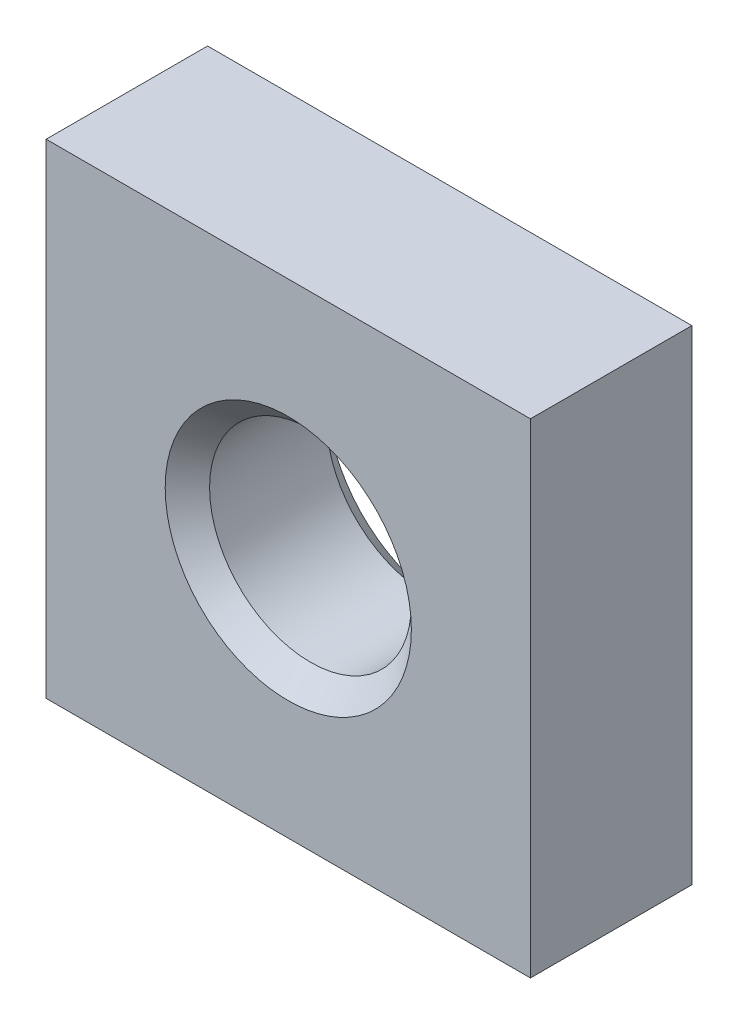
ISO-10303-21;
HEADER;
FILE_DESCRIPTION(('STEP AP214'),'2;1');
FILE_NAME('part.step','',(''),(''),'','','');
FILE_SCHEMA(('AUTOMOTIVE_DESIGN { 1 0 10303 214 1 1 1 1 }'));
ENDSEC;
DATA;
#1=APPLICATION_CONTEXT('core data for automotive mechanical design processes');
#2=APPLICATION_PROTOCOL_DEFINITION('international standard','automotive_design',2000,#1);
#3=PRODUCT_CONTEXT('',#1,'mechanical');
#4=PRODUCT('Part','Part','',(#3));
#5=PRODUCT_RELATED_PRODUCT_CATEGORY('part','',(#4));
#6=PRODUCT_DEFINITION_FORMATION('','',#4);
#7=PRODUCT_DEFINITION_CONTEXT('part definition',#1,'design');
#8=PRODUCT_DEFINITION('design','',#6,#7);
#9=PRODUCT_DEFINITION_SHAPE('','',#8);
#10=(LENGTH_UNIT() NAMED_UNIT(*) SI_UNIT(.MILLI.,.METRE.));
#11=(NAMED_UNIT(*) PLANE_ANGLE_UNIT() SI_UNIT($,.RADIAN.));
#12=(NAMED_UNIT(*) SI_UNIT($,.STERADIAN.) SOLID_ANGLE_UNIT());
#13=UNCERTAINTY_MEASURE_WITH_UNIT(LENGTH_MEASURE(1.E-05),#10,'distance_accuracy_value','');
#14=(GEOMETRIC_REPRESENTATION_CONTEXT(3) GLOBAL_UNCERTAINTY_ASSIGNED_CONTEXT((#13)) GLOBAL_UNIT_ASSIGNED_CONTEXT((#10,
#11,#12)) REPRESENTATION_CONTEXT('',''));
#15=CARTESIAN_POINT('',(0.,0.,0.));
#16=DIRECTION('',(0.,0.,1.));
#17=DIRECTION('',(1.,0.,0.));
#18=AXIS2_PLACEMENT_3D('',#15,#16,#17);
#19=CARTESIAN_POINT('',(3.,-2.99999999999999,2.));
#20=DIRECTION('',(-1.,0.,0.));
#21=DIRECTION('',(0.,0.,1.));
#22=AXIS2_PLACEMENT_3D('',#19,#20,#21);
#23=PLANE('',#22);
#24=DIRECTION('',(0.,1.,0.));
#25=VECTOR('',#24,1.);
#26=CARTESIAN_POINT('',(3.,-2.99999999999999,0.));
#27=LINE('',#26,#25);
#28=CARTESIAN_POINT('',(3.,-2.99999999999999,0.));
#29=VERTEX_POINT('',#28);
#30=CARTESIAN_POINT('',(3.,2.99999999999999,0.));
#31=VERTEX_POINT('',#30);
#32=EDGE_CURVE('E98',#29,#31,#27,.T.);
#33=ORIENTED_EDGE('',*,*,#32,.T.);
#34=DIRECTION('',(0.,0.,-1.));
#35=VECTOR('',#34,1.);
#36=CARTESIAN_POINT('',(3.,2.99999999999999,2.));
#37=LINE('',#36,#35);
#38=CARTESIAN_POINT('',(3.,2.99999999999999,2.));
#39=VERTEX_POINT('',#38);
#40=EDGE_CURVE('E11',#39,#31,#37,.T.);
#41=ORIENTED_EDGE('',*,*,#40,.F.);
#42=DIRECTION('',(0.,1.,0.));
#43=VECTOR('',#42,1.);
#44=CARTESIAN_POINT('',(3.,-2.99999999999999,2.));
#45=LINE('',#44,#43);
#46=CARTESIAN_POINT('',(3.,-2.99999999999999,2.));
#47=VERTEX_POINT('',#46);
#48=EDGE_CURVE('E86',#47,#39,#45,.T.);
#49=ORIENTED_EDGE('',*,*,#48,.F.);
#50=DIRECTION('',(0.,0.,-1.));
#51=VECTOR('',#50,1.);
#52=CARTESIAN_POINT('',(3.,-2.99999999999999,2.));
#53=LINE('',#52,#51);
#54=EDGE_CURVE('E94',#47,#29,#53,.T.);
#55=ORIENTED_EDGE('',*,*,#54,.T.);
#56=EDGE_LOOP('',(#33,#41,#49,#55));
#57=FACE_BOUND('',#56,.T.);
#58=ADVANCED_FACE('F35',(#57),#23,.F.);
#59=CARTESIAN_POINT('',(-3.,2.99999999999999,2.));
#60=DIRECTION('',(0.,-1.,0.));
#61=DIRECTION('',(0.,0.,-1.));
#62=AXIS2_PLACEMENT_3D('',#59,#60,#61);
#63=PLANE('',#62);
#64=DIRECTION('',(-1.,0.,0.));
#65=VECTOR('',#64,1.);
#66=CARTESIAN_POINT('',(-3.,2.99999999999999,0.));
#67=LINE('',#66,#65);
#68=CARTESIAN_POINT('',(-3.,2.99999999999999,0.));
#69=VERTEX_POINT('',#68);
#70=EDGE_CURVE('E90',#31,#69,#67,.T.);
#71=ORIENTED_EDGE('',*,*,#70,.T.);
#72=DIRECTION('',(0.,0.,-1.));
#73=VECTOR('',#72,1.);
#74=CARTESIAN_POINT('',(-3.,2.99999999999999,2.));
#75=LINE('',#74,#73);
#76=CARTESIAN_POINT('',(-3.,2.99999999999999,2.));
#77=VERTEX_POINT('',#76);
#78=EDGE_CURVE('E43',#77,#69,#75,.T.);
#79=ORIENTED_EDGE('',*,*,#78,.F.);
#80=DIRECTION('',(-1.,0.,0.));
#81=VECTOR('',#80,1.);
#82=CARTESIAN_POINT('',(-3.,2.99999999999999,2.));
#83=LINE('',#82,#81);
#84=EDGE_CURVE('E81',#39,#77,#83,.T.);
#85=ORIENTED_EDGE('',*,*,#84,.F.);
#86=ORIENTED_EDGE('',*,*,#40,.T.);
#87=EDGE_LOOP('',(#71,#79,#85,#86));
#88=FACE_BOUND('',#87,.T.);
#89=ADVANCED_FACE('F89',(#88),#63,.F.);
#90=CARTESIAN_POINT('',(-3.,-2.99999999999999,2.));
#91=DIRECTION('',(1.,0.,0.));
#92=DIRECTION('',(0.,0.,-1.));
#93=AXIS2_PLACEMENT_3D('',#90,#91,#92);
#94=PLANE('',#93);
#95=DIRECTION('',(0.,-1.,0.));
#96=VECTOR('',#95,1.);
#97=CARTESIAN_POINT('',(-3.,-2.99999999999999,0.));
#98=LINE('',#97,#96);
#99=CARTESIAN_POINT('',(-3.,-2.99999999999999,0.));
#100=VERTEX_POINT('',#99);
#101=EDGE_CURVE('E68',#69,#100,#98,.T.);
#102=ORIENTED_EDGE('',*,*,#101,.T.);
#103=DIRECTION('',(0.,0.,-1.));
#104=VECTOR('',#103,1.);
#105=CARTESIAN_POINT('',(-3.,-2.99999999999999,2.));
#106=LINE('',#105,#104);
#107=CARTESIAN_POINT('',(-3.,-2.99999999999999,2.));
#108=VERTEX_POINT('',#107);
#109=EDGE_CURVE('E91',#108,#100,#106,.T.);
#110=ORIENTED_EDGE('',*,*,#109,.F.);
#111=DIRECTION('',(0.,-1.,0.));
#112=VECTOR('',#111,1.);
#113=CARTESIAN_POINT('',(-3.,-2.99999999999999,2.));
#114=LINE('',#113,#112);
#115=EDGE_CURVE('E84',#77,#108,#114,.T.);
#116=ORIENTED_EDGE('',*,*,#115,.F.);
#117=ORIENTED_EDGE('',*,*,#78,.T.);
#118=EDGE_LOOP('',(#102,#110,#116,#117));
#119=FACE_BOUND('',#118,.T.);
#120=ADVANCED_FACE('F92',(#119),#94,.F.);
#121=CARTESIAN_POINT('',(-3.,-2.99999999999999,2.));
#122=DIRECTION('',(0.,1.,0.));
#123=DIRECTION('',(0.,0.,1.));
#124=AXIS2_PLACEMENT_3D('',#121,#122,#123);
#125=PLANE('',#124);
#126=DIRECTION('',(1.,0.,0.));
#127=VECTOR('',#126,1.);
#128=CARTESIAN_POINT('',(-3.,-2.99999999999999,0.));
#129=LINE('',#128,#127);
#130=EDGE_CURVE('E74',#100,#29,#129,.T.);
#131=ORIENTED_EDGE('',*,*,#130,.T.);
#132=ORIENTED_EDGE('',*,*,#54,.F.);
#133=DIRECTION('',(1.,0.,0.));
#134=VECTOR('',#133,1.);
#135=CARTESIAN_POINT('',(-3.,-2.99999999999999,2.));
#136=LINE('',#135,#134);
#137=EDGE_CURVE('E51',#108,#47,#136,.T.);
#138=ORIENTED_EDGE('',*,*,#137,.F.);
#139=ORIENTED_EDGE('',*,*,#109,.T.);
#140=EDGE_LOOP('',(#131,#132,#138,#139));
#141=FACE_BOUND('',#140,.T.);
#142=ADVANCED_FACE('F106',(#141),#125,.F.);
#143=CARTESIAN_POINT('',(0.,0.,2.));
#144=DIRECTION('',(0.,0.,-1.));
#145=DIRECTION('',(-1.,0.,0.));
#146=AXIS2_PLACEMENT_3D('',#143,#144,#145);
#147=PLANE('',#146);
#148=CARTESIAN_POINT('',(0.,0.,2.));
#149=DIRECTION('',(0.,0.,1.));
#150=DIRECTION('',(1.,0.,0.));
#151=AXIS2_PLACEMENT_3D('',#148,#149,#150);
#152=CIRCLE('',#151,1.525);
#153=CARTESIAN_POINT('',(1.525,0.,2.));
#154=VERTEX_POINT('',#153);
#155=EDGE_CURVE('E117',#154,#154,#152,.T.);
#156=ORIENTED_EDGE('',*,*,#155,.F.);
#157=EDGE_LOOP('',(#156));
#158=FACE_BOUND('',#157,.T.);
#159=ORIENTED_EDGE('',*,*,#48,.T.);
#160=ORIENTED_EDGE('',*,*,#84,.T.);
#161=ORIENTED_EDGE('',*,*,#115,.T.);
#162=ORIENTED_EDGE('',*,*,#137,.T.);
#163=EDGE_LOOP('',(#159,#160,#161,#162));
#164=FACE_BOUND('',#163,.T.);
#165=ADVANCED_FACE('F82',(#158,#164),#147,.F.);
#166=CARTESIAN_POINT('',(0.,0.,0.));
#167=DIRECTION('',(0.,0.,-1.));
#168=DIRECTION('',(-1.,0.,0.));
#169=AXIS2_PLACEMENT_3D('',#166,#167,#168);
#170=PLANE('',#169);
#171=CARTESIAN_POINT('',(0.,0.,0.));
#172=DIRECTION('',(0.,0.,1.));
#173=DIRECTION('',(1.,0.,0.));
#174=AXIS2_PLACEMENT_3D('',#171,#172,#173);
#175=CIRCLE('',#174,1.525);
#176=CARTESIAN_POINT('',(1.525,0.,0.));
#177=VERTEX_POINT('',#176);
#178=EDGE_CURVE('E120',#177,#177,#175,.T.);
#179=ORIENTED_EDGE('',*,*,#178,.T.);
#180=EDGE_LOOP('',(#179));
#181=FACE_BOUND('',#180,.T.);
#182=ORIENTED_EDGE('',*,*,#32,.F.);
#183=ORIENTED_EDGE('',*,*,#130,.F.);
#184=ORIENTED_EDGE('',*,*,#101,.F.);
#185=ORIENTED_EDGE('',*,*,#70,.F.);
#186=EDGE_LOOP('',(#182,#183,#184,#185));
#187=FACE_BOUND('',#186,.T.);
#188=ADVANCED_FACE('F109',(#181,#187),#170,.T.);
#189=CARTESIAN_POINT('',(0.,0.,0.275000000000001));
#190=DIRECTION('',(0.,0.,-1.));
#191=DIRECTION('',(-1.,0.,0.));
#192=AXIS2_PLACEMENT_3D('',#189,#190,#191);
#193=CONICAL_SURFACE('',#192,1.25,0.785398163397448);
#194=ORIENTED_EDGE('',*,*,#178,.F.);
#195=EDGE_LOOP('',(#194));
#196=FACE_BOUND('',#195,.T.);
#197=CARTESIAN_POINT('',(0.,0.,0.275000000000001));
#198=DIRECTION('',(0.,0.,1.));
#199=DIRECTION('',(1.,0.,0.));
#200=AXIS2_PLACEMENT_3D('',#197,#198,#199);
#201=CIRCLE('',#200,1.25);
#202=CARTESIAN_POINT('',(1.25,0.,0.275000000000001));
#203=VERTEX_POINT('',#202);
#204=EDGE_CURVE('E101',#203,#203,#201,.T.);
#205=ORIENTED_EDGE('',*,*,#204,.T.);
#206=EDGE_LOOP('',(#205));
#207=FACE_BOUND('',#206,.T.);
#208=ADVANCED_FACE('F125',(#196,#207),#193,.F.);
#209=CARTESIAN_POINT('',(0.,0.,2.));
#210=DIRECTION('',(0.,0.,1.));
#211=DIRECTION('',(1.,0.,0.));
#212=AXIS2_PLACEMENT_3D('',#209,#210,#211);
#213=CYLINDRICAL_SURFACE('',#212,1.25);
#214=ORIENTED_EDGE('',*,*,#204,.F.);
#215=EDGE_LOOP('',(#214));
#216=FACE_BOUND('',#215,.T.);
#217=CARTESIAN_POINT('',(0.,0.,1.725));
#218=DIRECTION('',(0.,0.,1.));
#219=DIRECTION('',(1.,0.,0.));
#220=AXIS2_PLACEMENT_3D('',#217,#218,#219);
#221=CIRCLE('',#220,1.25);
#222=CARTESIAN_POINT('',(1.25,0.,1.725));
#223=VERTEX_POINT('',#222);
#224=EDGE_CURVE('E114',#223,#223,#221,.T.);
#225=ORIENTED_EDGE('',*,*,#224,.T.);
#226=EDGE_LOOP('',(#225));
#227=FACE_BOUND('',#226,.T.);
#228=ADVANCED_FACE('F128',(#216,#227),#213,.F.);
#229=CARTESIAN_POINT('',(0.,0.,2.));
#230=DIRECTION('',(0.,0.,1.));
#231=DIRECTION('',(1.,0.,0.));
#232=AXIS2_PLACEMENT_3D('',#229,#230,#231);
#233=CONICAL_SURFACE('',#232,1.525,0.785398163397447);
#234=ORIENTED_EDGE('',*,*,#224,.F.);
#235=EDGE_LOOP('',(#234));
#236=FACE_BOUND('',#235,.T.);
#237=ORIENTED_EDGE('',*,*,#155,.T.);
#238=EDGE_LOOP('',(#237));
#239=FACE_BOUND('',#238,.T.);
#240=ADVANCED_FACE('F134',(#236,#239),#233,.F.);
#241=CLOSED_SHELL('',(#58,#89,#120,#142,#165,#188,#208,#228,#240));
#242=MANIFOLD_SOLID_BREP('B2',#241);
#243=ADVANCED_BREP_SHAPE_REPRESENTATION('',(#18,#242),#14);
#244=SHAPE_DEFINITION_REPRESENTATION(#9,#243);
ENDSEC;
END-ISO-10303-21;
